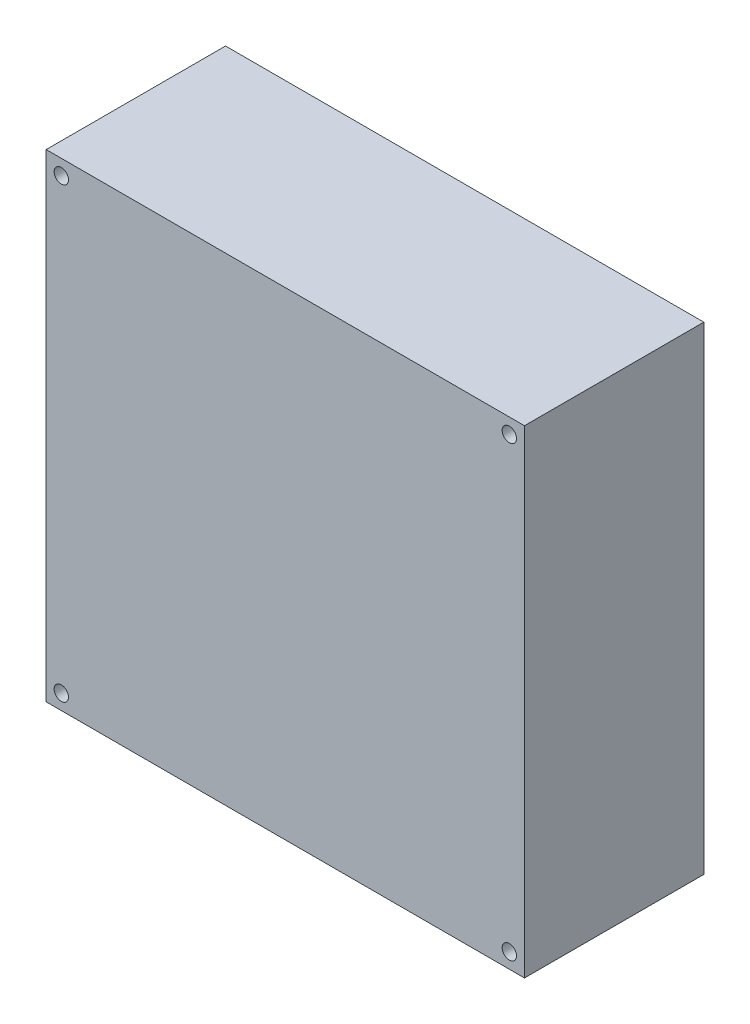
ISO-10303-21;
HEADER;
FILE_DESCRIPTION(('STEP AP214'),'2;1');
FILE_NAME('part.step','',(''),(''),'','','');
FILE_SCHEMA(('AUTOMOTIVE_DESIGN { 1 0 10303 214 1 1 1 1 }'));
ENDSEC;
DATA;
#1=APPLICATION_CONTEXT('core data for automotive mechanical design processes');
#2=APPLICATION_PROTOCOL_DEFINITION('international standard','automotive_design',2000,#1);
#3=PRODUCT_CONTEXT('',#1,'mechanical');
#4=PRODUCT('Part','Part','',(#3));
#5=PRODUCT_RELATED_PRODUCT_CATEGORY('part','',(#4));
#6=PRODUCT_DEFINITION_FORMATION('','',#4);
#7=PRODUCT_DEFINITION_CONTEXT('part definition',#1,'design');
#8=PRODUCT_DEFINITION('design','',#6,#7);
#9=PRODUCT_DEFINITION_SHAPE('','',#8);
#10=(LENGTH_UNIT() NAMED_UNIT(*) SI_UNIT(.MILLI.,.METRE.));
#11=(NAMED_UNIT(*) PLANE_ANGLE_UNIT() SI_UNIT($,.RADIAN.));
#12=(NAMED_UNIT(*) SI_UNIT($,.STERADIAN.) SOLID_ANGLE_UNIT());
#13=UNCERTAINTY_MEASURE_WITH_UNIT(LENGTH_MEASURE(1.E-05),#10,'distance_accuracy_value','');
#14=(GEOMETRIC_REPRESENTATION_CONTEXT(3) GLOBAL_UNCERTAINTY_ASSIGNED_CONTEXT((#13)) GLOBAL_UNIT_ASSIGNED_CONTEXT((#10,
#11,#12)) REPRESENTATION_CONTEXT('',''));
#15=CARTESIAN_POINT('',(0.,0.,0.));
#16=DIRECTION('',(0.,0.,1.));
#17=DIRECTION('',(1.,0.,0.));
#18=AXIS2_PLACEMENT_3D('',#15,#16,#17);
#19=CARTESIAN_POINT('',(0.,0.,45.));
#20=DIRECTION('',(1.,0.,0.));
#21=DIRECTION('',(0.,0.,-1.));
#22=AXIS2_PLACEMENT_3D('',#19,#20,#21);
#23=PLANE('',#22);
#24=DIRECTION('',(0.,-1.,0.));
#25=VECTOR('',#24,1.);
#26=CARTESIAN_POINT('',(0.,0.,0.));
#27=LINE('',#26,#25);
#28=CARTESIAN_POINT('',(0.,120.,0.));
#29=VERTEX_POINT('',#28);
#30=CARTESIAN_POINT('',(0.,0.,0.));
#31=VERTEX_POINT('',#30);
#32=EDGE_CURVE('E97',#29,#31,#27,.T.);
#33=ORIENTED_EDGE('',*,*,#32,.T.);
#34=DIRECTION('',(0.,0.,-1.));
#35=VECTOR('',#34,1.);
#36=CARTESIAN_POINT('',(0.,0.,45.));
#37=LINE('',#36,#35);
#38=CARTESIAN_POINT('',(0.,0.,45.));
#39=VERTEX_POINT('',#38);
#40=EDGE_CURVE('E11',#39,#31,#37,.T.);
#41=ORIENTED_EDGE('',*,*,#40,.F.);
#42=DIRECTION('',(0.,-1.,0.));
#43=VECTOR('',#42,1.);
#44=CARTESIAN_POINT('',(0.,0.,45.));
#45=LINE('',#44,#43);
#46=CARTESIAN_POINT('',(0.,120.,45.));
#47=VERTEX_POINT('',#46);
#48=EDGE_CURVE('E85',#47,#39,#45,.T.);
#49=ORIENTED_EDGE('',*,*,#48,.F.);
#50=DIRECTION('',(0.,0.,-1.));
#51=VECTOR('',#50,1.);
#52=CARTESIAN_POINT('',(0.,120.,45.));
#53=LINE('',#52,#51);
#54=EDGE_CURVE('E93',#47,#29,#53,.T.);
#55=ORIENTED_EDGE('',*,*,#54,.T.);
#56=EDGE_LOOP('',(#33,#41,#49,#55));
#57=FACE_BOUND('',#56,.T.);
#58=ADVANCED_FACE('F34',(#57),#23,.F.);
#59=CARTESIAN_POINT('',(0.,0.,45.));
#60=DIRECTION('',(0.,1.,0.));
#61=DIRECTION('',(0.,0.,1.));
#62=AXIS2_PLACEMENT_3D('',#59,#60,#61);
#63=PLANE('',#62);
#64=DIRECTION('',(1.,0.,0.));
#65=VECTOR('',#64,1.);
#66=CARTESIAN_POINT('',(0.,0.,0.));
#67=LINE('',#66,#65);
#68=CARTESIAN_POINT('',(120.,0.,0.));
#69=VERTEX_POINT('',#68);
#70=EDGE_CURVE('E89',#31,#69,#67,.T.);
#71=ORIENTED_EDGE('',*,*,#70,.T.);
#72=DIRECTION('',(0.,0.,-1.));
#73=VECTOR('',#72,1.);
#74=CARTESIAN_POINT('',(120.,0.,45.));
#75=LINE('',#74,#73);
#76=CARTESIAN_POINT('',(120.,0.,45.));
#77=VERTEX_POINT('',#76);
#78=EDGE_CURVE('E42',#77,#69,#75,.T.);
#79=ORIENTED_EDGE('',*,*,#78,.F.);
#80=DIRECTION('',(1.,0.,0.));
#81=VECTOR('',#80,1.);
#82=CARTESIAN_POINT('',(0.,0.,45.));
#83=LINE('',#82,#81);
#84=EDGE_CURVE('E80',#39,#77,#83,.T.);
#85=ORIENTED_EDGE('',*,*,#84,.F.);
#86=ORIENTED_EDGE('',*,*,#40,.T.);
#87=EDGE_LOOP('',(#71,#79,#85,#86));
#88=FACE_BOUND('',#87,.T.);
#89=ADVANCED_FACE('F88',(#88),#63,.F.);
#90=CARTESIAN_POINT('',(120.,0.,45.));
#91=DIRECTION('',(-1.,0.,0.));
#92=DIRECTION('',(0.,0.,1.));
#93=AXIS2_PLACEMENT_3D('',#90,#91,#92);
#94=PLANE('',#93);
#95=DIRECTION('',(0.,1.,0.));
#96=VECTOR('',#95,1.);
#97=CARTESIAN_POINT('',(120.,0.,0.));
#98=LINE('',#97,#96);
#99=CARTESIAN_POINT('',(120.,120.,0.));
#100=VERTEX_POINT('',#99);
#101=EDGE_CURVE('E67',#69,#100,#98,.T.);
#102=ORIENTED_EDGE('',*,*,#101,.T.);
#103=DIRECTION('',(0.,0.,-1.));
#104=VECTOR('',#103,1.);
#105=CARTESIAN_POINT('',(120.,120.,45.));
#106=LINE('',#105,#104);
#107=CARTESIAN_POINT('',(120.,120.,45.));
#108=VERTEX_POINT('',#107);
#109=EDGE_CURVE('E90',#108,#100,#106,.T.);
#110=ORIENTED_EDGE('',*,*,#109,.F.);
#111=DIRECTION('',(0.,1.,0.));
#112=VECTOR('',#111,1.);
#113=CARTESIAN_POINT('',(120.,0.,45.));
#114=LINE('',#113,#112);
#115=EDGE_CURVE('E83',#77,#108,#114,.T.);
#116=ORIENTED_EDGE('',*,*,#115,.F.);
#117=ORIENTED_EDGE('',*,*,#78,.T.);
#118=EDGE_LOOP('',(#102,#110,#116,#117));
#119=FACE_BOUND('',#118,.T.);
#120=ADVANCED_FACE('F91',(#119),#94,.F.);
#121=CARTESIAN_POINT('',(0.,120.,45.));
#122=DIRECTION('',(0.,-1.,0.));
#123=DIRECTION('',(0.,0.,-1.));
#124=AXIS2_PLACEMENT_3D('',#121,#122,#123);
#125=PLANE('',#124);
#126=DIRECTION('',(-1.,0.,0.));
#127=VECTOR('',#126,1.);
#128=CARTESIAN_POINT('',(0.,120.,0.));
#129=LINE('',#128,#127);
#130=EDGE_CURVE('E73',#100,#29,#129,.T.);
#131=ORIENTED_EDGE('',*,*,#130,.T.);
#132=ORIENTED_EDGE('',*,*,#54,.F.);
#133=DIRECTION('',(-1.,0.,0.));
#134=VECTOR('',#133,1.);
#135=CARTESIAN_POINT('',(0.,120.,45.));
#136=LINE('',#135,#134);
#137=EDGE_CURVE('E50',#108,#47,#136,.T.);
#138=ORIENTED_EDGE('',*,*,#137,.F.);
#139=ORIENTED_EDGE('',*,*,#109,.T.);
#140=EDGE_LOOP('',(#131,#132,#138,#139));
#141=FACE_BOUND('',#140,.T.);
#142=ADVANCED_FACE('F105',(#141),#125,.F.);
#143=CARTESIAN_POINT('',(0.,0.,45.));
#144=DIRECTION('',(0.,0.,-1.));
#145=DIRECTION('',(-1.,0.,0.));
#146=AXIS2_PLACEMENT_3D('',#143,#144,#145);
#147=PLANE('',#146);
#148=CARTESIAN_POINT('',(3.80000000000487,3.80000000000057,45.));
#149=DIRECTION('',(0.,0.,1.));
#150=DIRECTION('',(1.,0.,0.));
#151=AXIS2_PLACEMENT_3D('',#148,#149,#150);
#152=CIRCLE('',#151,1.8);
#153=CARTESIAN_POINT('',(5.60000000000487,3.80000000000057,45.));
#154=VERTEX_POINT('',#153);
#155=EDGE_CURVE('E120',#154,#154,#152,.T.);
#156=ORIENTED_EDGE('',*,*,#155,.F.);
#157=EDGE_LOOP('',(#156));
#158=FACE_BOUND('',#157,.T.);
#159=CARTESIAN_POINT('',(116.200000000005,3.80000000000508,45.));
#160=DIRECTION('',(0.,0.,1.));
#161=DIRECTION('',(1.,0.,0.));
#162=AXIS2_PLACEMENT_3D('',#159,#160,#161);
#163=CIRCLE('',#162,1.8);
#164=CARTESIAN_POINT('',(118.000000000005,3.80000000000508,45.));
#165=VERTEX_POINT('',#164);
#166=EDGE_CURVE('E126',#165,#165,#163,.T.);
#167=ORIENTED_EDGE('',*,*,#166,.F.);
#168=EDGE_LOOP('',(#167));
#169=FACE_BOUND('',#168,.T.);
#170=CARTESIAN_POINT('',(116.2,116.200000000005,45.));
#171=DIRECTION('',(0.,0.,1.));
#172=DIRECTION('',(1.,0.,0.));
#173=AXIS2_PLACEMENT_3D('',#170,#171,#172);
#174=CIRCLE('',#173,1.80000000000001);
#175=CARTESIAN_POINT('',(118.,116.200000000005,45.));
#176=VERTEX_POINT('',#175);
#177=EDGE_CURVE('E114',#176,#176,#174,.T.);
#178=ORIENTED_EDGE('',*,*,#177,.F.);
#179=EDGE_LOOP('',(#178));
#180=FACE_BOUND('',#179,.T.);
#181=CARTESIAN_POINT('',(3.8,116.2,45.));
#182=DIRECTION('',(0.,0.,1.));
#183=DIRECTION('',(1.,0.,0.));
#184=AXIS2_PLACEMENT_3D('',#181,#182,#183);
#185=CIRCLE('',#184,1.8);
#186=CARTESIAN_POINT('',(5.6,116.2,45.));
#187=VERTEX_POINT('',#186);
#188=EDGE_CURVE('E100',#187,#187,#185,.T.);
#189=ORIENTED_EDGE('',*,*,#188,.F.);
#190=EDGE_LOOP('',(#189));
#191=FACE_BOUND('',#190,.T.);
#192=ORIENTED_EDGE('',*,*,#48,.T.);
#193=ORIENTED_EDGE('',*,*,#84,.T.);
#194=ORIENTED_EDGE('',*,*,#115,.T.);
#195=ORIENTED_EDGE('',*,*,#137,.T.);
#196=EDGE_LOOP('',(#192,#193,#194,#195));
#197=FACE_BOUND('',#196,.T.);
#198=ADVANCED_FACE('F81',(#158,#169,#180,#191,#197),#147,.F.);
#199=CARTESIAN_POINT('',(0.,0.,0.));
#200=DIRECTION('',(0.,0.,-1.));
#201=DIRECTION('',(-1.,0.,0.));
#202=AXIS2_PLACEMENT_3D('',#199,#200,#201);
#203=PLANE('',#202);
#204=CARTESIAN_POINT('',(3.80000000000487,3.80000000000057,0.));
#205=DIRECTION('',(0.,0.,-1.));
#206=DIRECTION('',(-1.,0.,0.));
#207=AXIS2_PLACEMENT_3D('',#204,#205,#206);
#208=CIRCLE('',#207,1.8);
#209=CARTESIAN_POINT('',(2.00000000000487,3.80000000000057,0.));
#210=VERTEX_POINT('',#209);
#211=EDGE_CURVE('E117',#210,#210,#208,.F.);
#212=ORIENTED_EDGE('',*,*,#211,.T.);
#213=EDGE_LOOP('',(#212));
#214=FACE_BOUND('',#213,.T.);
#215=CARTESIAN_POINT('',(116.200000000005,3.80000000000508,0.));
#216=DIRECTION('',(0.,0.,-1.));
#217=DIRECTION('',(-1.,0.,0.));
#218=AXIS2_PLACEMENT_3D('',#215,#216,#217);
#219=CIRCLE('',#218,1.8);
#220=CARTESIAN_POINT('',(114.400000000005,3.80000000000508,0.));
#221=VERTEX_POINT('',#220);
#222=EDGE_CURVE('E123',#221,#221,#219,.F.);
#223=ORIENTED_EDGE('',*,*,#222,.T.);
#224=EDGE_LOOP('',(#223));
#225=FACE_BOUND('',#224,.T.);
#226=CARTESIAN_POINT('',(116.2,116.200000000005,0.));
#227=DIRECTION('',(0.,0.,-1.));
#228=DIRECTION('',(-1.,0.,0.));
#229=AXIS2_PLACEMENT_3D('',#226,#227,#228);
#230=CIRCLE('',#229,1.80000000000001);
#231=CARTESIAN_POINT('',(114.4,116.200000000005,0.));
#232=VERTEX_POINT('',#231);
#233=EDGE_CURVE('E129',#232,#232,#230,.F.);
#234=ORIENTED_EDGE('',*,*,#233,.T.);
#235=EDGE_LOOP('',(#234));
#236=FACE_BOUND('',#235,.T.);
#237=CARTESIAN_POINT('',(3.8,116.2,0.));
#238=DIRECTION('',(0.,0.,-1.));
#239=DIRECTION('',(-1.,0.,0.));
#240=AXIS2_PLACEMENT_3D('',#237,#238,#239);
#241=CIRCLE('',#240,1.8);
#242=CARTESIAN_POINT('',(2.,116.2,0.));
#243=VERTEX_POINT('',#242);
#244=EDGE_CURVE('E111',#243,#243,#241,.F.);
#245=ORIENTED_EDGE('',*,*,#244,.T.);
#246=EDGE_LOOP('',(#245));
#247=FACE_BOUND('',#246,.T.);
#248=ORIENTED_EDGE('',*,*,#32,.F.);
#249=ORIENTED_EDGE('',*,*,#130,.F.);
#250=ORIENTED_EDGE('',*,*,#101,.F.);
#251=ORIENTED_EDGE('',*,*,#70,.F.);
#252=EDGE_LOOP('',(#248,#249,#250,#251));
#253=FACE_BOUND('',#252,.T.);
#254=ADVANCED_FACE('F108',(#214,#225,#236,#247,#253),#203,.T.);
#255=CARTESIAN_POINT('',(3.8,116.2,-0.001000000000001));
#256=DIRECTION('',(0.,0.,1.));
#257=DIRECTION('',(1.,0.,0.));
#258=AXIS2_PLACEMENT_3D('',#255,#256,#257);
#259=CYLINDRICAL_SURFACE('',#258,1.8);
#260=ORIENTED_EDGE('',*,*,#244,.F.);
#261=EDGE_LOOP('',(#260));
#262=FACE_BOUND('',#261,.T.);
#263=ORIENTED_EDGE('',*,*,#188,.T.);
#264=EDGE_LOOP('',(#263));
#265=FACE_BOUND('',#264,.T.);
#266=ADVANCED_FACE('F143',(#262,#265),#259,.F.);
#267=CARTESIAN_POINT('',(116.2,116.200000000005,-0.001000000000001));
#268=DIRECTION('',(0.,0.,1.));
#269=DIRECTION('',(1.,0.,0.));
#270=AXIS2_PLACEMENT_3D('',#267,#268,#269);
#271=CYLINDRICAL_SURFACE('',#270,1.80000000000001);
#272=ORIENTED_EDGE('',*,*,#233,.F.);
#273=EDGE_LOOP('',(#272));
#274=FACE_BOUND('',#273,.T.);
#275=ORIENTED_EDGE('',*,*,#177,.T.);
#276=EDGE_LOOP('',(#275));
#277=FACE_BOUND('',#276,.T.);
#278=ADVANCED_FACE('F135',(#274,#277),#271,.F.);
#279=CARTESIAN_POINT('',(116.200000000005,3.80000000000508,-0.001000000000001));
#280=DIRECTION('',(0.,0.,1.));
#281=DIRECTION('',(1.,0.,0.));
#282=AXIS2_PLACEMENT_3D('',#279,#280,#281);
#283=CYLINDRICAL_SURFACE('',#282,1.8);
#284=ORIENTED_EDGE('',*,*,#222,.F.);
#285=EDGE_LOOP('',(#284));
#286=FACE_BOUND('',#285,.T.);
#287=ORIENTED_EDGE('',*,*,#166,.T.);
#288=EDGE_LOOP('',(#287));
#289=FACE_BOUND('',#288,.T.);
#290=ADVANCED_FACE('F151',(#286,#289),#283,.F.);
#291=CARTESIAN_POINT('',(3.80000000000487,3.80000000000057,-0.001000000000001));
#292=DIRECTION('',(0.,0.,1.));
#293=DIRECTION('',(1.,0.,0.));
#294=AXIS2_PLACEMENT_3D('',#291,#292,#293);
#295=CYLINDRICAL_SURFACE('',#294,1.8);
#296=ORIENTED_EDGE('',*,*,#211,.F.);
#297=EDGE_LOOP('',(#296));
#298=FACE_BOUND('',#297,.T.);
#299=ORIENTED_EDGE('',*,*,#155,.T.);
#300=EDGE_LOOP('',(#299));
#301=FACE_BOUND('',#300,.T.);
#302=ADVANCED_FACE('F199',(#298,#301),#295,.F.);
#303=CLOSED_SHELL('',(#58,#89,#120,#142,#198,#254,#266,#278,#290,#302));
#304=MANIFOLD_SOLID_BREP('B2',#303);
#305=ADVANCED_BREP_SHAPE_REPRESENTATION('',(#18,#304),#14);
#306=SHAPE_DEFINITION_REPRESENTATION(#9,#305);
ENDSEC;
END-ISO-10303-21;
